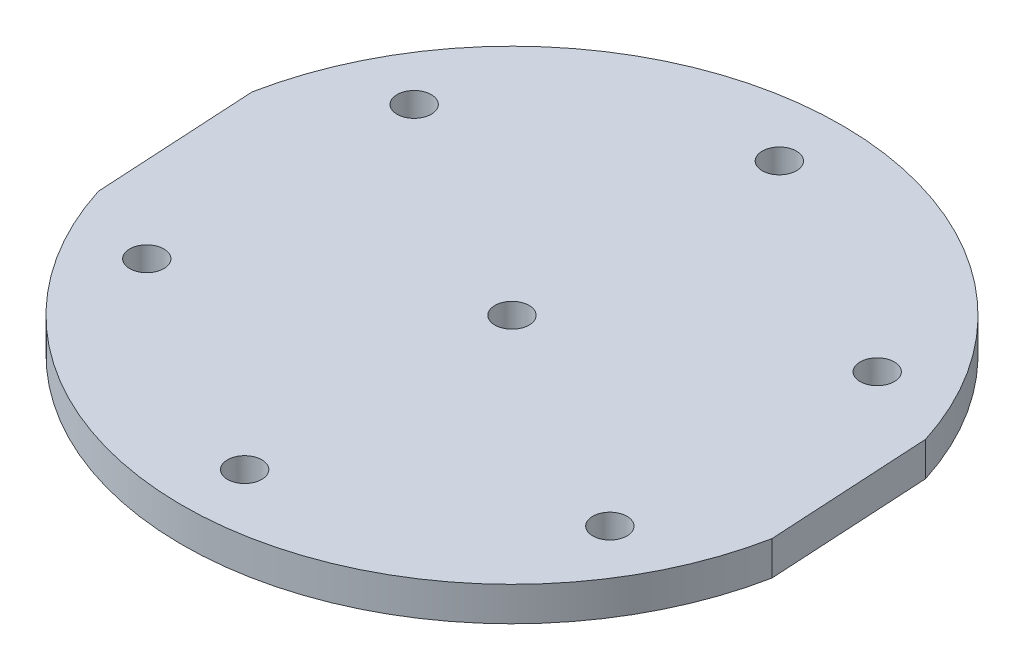
ISO-10303-21;
HEADER;
FILE_DESCRIPTION(('STEP AP214'),'2;1');
FILE_NAME('part.step','',(''),(''),'','','');
FILE_SCHEMA(('AUTOMOTIVE_DESIGN { 1 0 10303 214 1 1 1 1 }'));
ENDSEC;
DATA;
#1=APPLICATION_CONTEXT('core data for automotive mechanical design processes');
#2=APPLICATION_PROTOCOL_DEFINITION('international standard','automotive_design',2000,#1);
#3=PRODUCT_CONTEXT('',#1,'mechanical');
#4=PRODUCT('Part','Part','',(#3));
#5=PRODUCT_RELATED_PRODUCT_CATEGORY('part','',(#4));
#6=PRODUCT_DEFINITION_FORMATION('','',#4);
#7=PRODUCT_DEFINITION_CONTEXT('part definition',#1,'design');
#8=PRODUCT_DEFINITION('design','',#6,#7);
#9=PRODUCT_DEFINITION_SHAPE('','',#8);
#10=(LENGTH_UNIT() NAMED_UNIT(*) SI_UNIT(.MILLI.,.METRE.));
#11=(NAMED_UNIT(*) PLANE_ANGLE_UNIT() SI_UNIT($,.RADIAN.));
#12=(NAMED_UNIT(*) SI_UNIT($,.STERADIAN.) SOLID_ANGLE_UNIT());
#13=UNCERTAINTY_MEASURE_WITH_UNIT(LENGTH_MEASURE(1.E-05),#10,'distance_accuracy_value','');
#14=(GEOMETRIC_REPRESENTATION_CONTEXT(3) GLOBAL_UNCERTAINTY_ASSIGNED_CONTEXT((#13)) GLOBAL_UNIT_ASSIGNED_CONTEXT((#10,
#11,#12)) REPRESENTATION_CONTEXT('',''));
#15=CARTESIAN_POINT('',(0.,0.,0.));
#16=DIRECTION('',(0.,0.,1.));
#17=DIRECTION('',(1.,0.,0.));
#18=AXIS2_PLACEMENT_3D('',#15,#16,#17);
#19=CARTESIAN_POINT('',(0.,5.,0.));
#20=DIRECTION('',(0.,1.,0.));
#21=DIRECTION('',(0.,0.,1.));
#22=AXIS2_PLACEMENT_3D('',#19,#20,#21);
#23=PLANE('',#22);
#24=CARTESIAN_POINT('',(33.8615932879713,5.,-19.5500000000004));
#25=DIRECTION('',(0.,1.,0.));
#26=DIRECTION('',(-0.866025403784433,0.,0.50000000000001));
#27=AXIS2_PLACEMENT_3D('',#24,#25,#26);
#28=CIRCLE('',#27,2.5);
#29=CARTESIAN_POINT('',(31.6965297785102,5.,-18.3000000000004));
#30=VERTEX_POINT('',#29);
#31=EDGE_CURVE('E325',#30,#30,#28,.T.);
#32=ORIENTED_EDGE('',*,*,#31,.F.);
#33=EDGE_LOOP('',(#32));
#34=FACE_BOUND('',#33,.T.);
#35=CARTESIAN_POINT('',(33.8615932879717,5.,19.5499999999997));
#36=DIRECTION('',(0.,1.,0.));
#37=DIRECTION('',(-0.866025403784443,0.,-0.499999999999992));
#38=AXIS2_PLACEMENT_3D('',#35,#36,#37);
#39=CIRCLE('',#38,2.5);
#40=CARTESIAN_POINT('',(31.6965297785106,5.,18.2999999999997));
#41=VERTEX_POINT('',#40);
#42=EDGE_CURVE('E327',#41,#41,#39,.T.);
#43=ORIENTED_EDGE('',*,*,#42,.F.);
#44=EDGE_LOOP('',(#43));
#45=FACE_BOUND('',#44,.T.);
#46=CARTESIAN_POINT('',(0.,5.,39.1));
#47=DIRECTION('',(0.,1.,0.));
#48=DIRECTION('',(0.,0.,-1.));
#49=AXIS2_PLACEMENT_3D('',#46,#47,#48);
#50=CIRCLE('',#49,2.5);
#51=CARTESIAN_POINT('',(0.,5.,36.6));
#52=VERTEX_POINT('',#51);
#53=EDGE_CURVE('E330',#52,#52,#50,.T.);
#54=ORIENTED_EDGE('',*,*,#53,.F.);
#55=EDGE_LOOP('',(#54));
#56=FACE_BOUND('',#55,.T.);
#57=CARTESIAN_POINT('',(-33.8615932879715,5.,19.5500000000002));
#58=DIRECTION('',(0.,1.,0.));
#59=DIRECTION('',(0.866025403784436,0.,-0.500000000000004));
#60=AXIS2_PLACEMENT_3D('',#57,#58,#59);
#61=CIRCLE('',#60,2.5);
#62=CARTESIAN_POINT('',(-31.6965297785104,5.,18.3000000000001));
#63=VERTEX_POINT('',#62);
#64=EDGE_CURVE('E336',#63,#63,#61,.T.);
#65=ORIENTED_EDGE('',*,*,#64,.F.);
#66=EDGE_LOOP('',(#65));
#67=FACE_BOUND('',#66,.T.);
#68=CARTESIAN_POINT('',(-33.8615932879716,5.,-19.5499999999999));
#69=DIRECTION('',(0.,1.,0.));
#70=DIRECTION('',(0.86602540378444,0.,0.499999999999998));
#71=AXIS2_PLACEMENT_3D('',#68,#69,#70);
#72=CIRCLE('',#71,2.5);
#73=CARTESIAN_POINT('',(-31.6965297785105,5.,-18.2999999999999));
#74=VERTEX_POINT('',#73);
#75=EDGE_CURVE('E141',#74,#74,#72,.T.);
#76=ORIENTED_EDGE('',*,*,#75,.F.);
#77=EDGE_LOOP('',(#76));
#78=FACE_BOUND('',#77,.T.);
#79=CARTESIAN_POINT('',(0.,5.,-39.1));
#80=DIRECTION('',(0.,1.,0.));
#81=DIRECTION('',(0.,0.,1.));
#82=AXIS2_PLACEMENT_3D('',#79,#80,#81);
#83=CIRCLE('',#82,2.5);
#84=CARTESIAN_POINT('',(0.,5.,-36.6));
#85=VERTEX_POINT('',#84);
#86=EDGE_CURVE('E135',#85,#85,#83,.T.);
#87=ORIENTED_EDGE('',*,*,#86,.F.);
#88=EDGE_LOOP('',(#87));
#89=FACE_BOUND('',#88,.T.);
#90=CARTESIAN_POINT('',(0.,5.,0.));
#91=DIRECTION('',(0.,1.,0.));
#92=DIRECTION('',(0.,0.,1.));
#93=AXIS2_PLACEMENT_3D('',#90,#91,#92);
#94=CIRCLE('',#93,48.2);
#95=CARTESIAN_POINT('',(45.9547992990247,5.,-14.5394780300519));
#96=VERTEX_POINT('',#95);
#97=CARTESIAN_POINT('',(-47.2972714529636,5.,-9.28483242200295));
#98=VERTEX_POINT('',#97);
#99=EDGE_CURVE('E98',#96,#98,#94,.T.);
#100=ORIENTED_EDGE('',*,*,#99,.T.);
#101=DIRECTION('',(0.0562595889512739,0.,0.99841617507482));
#102=VECTOR('',#101,1.);
#103=CARTESIAN_POINT('',(-47.2972714529636,5.,-9.28483242200295));
#104=LINE('',#103,#102);
#105=CARTESIAN_POINT('',(-45.9547992990246,5.,14.5394780300519));
#106=VERTEX_POINT('',#105);
#107=EDGE_CURVE('E93',#98,#106,#104,.T.);
#108=ORIENTED_EDGE('',*,*,#107,.T.);
#109=CARTESIAN_POINT('',(0.,5.,0.));
#110=DIRECTION('',(0.,1.,0.));
#111=DIRECTION('',(0.,0.,1.));
#112=AXIS2_PLACEMENT_3D('',#109,#110,#111);
#113=CIRCLE('',#112,48.2);
#114=CARTESIAN_POINT('',(47.2972714529636,5.,9.28483242200299));
#115=VERTEX_POINT('',#114);
#116=EDGE_CURVE('E96',#106,#115,#113,.T.);
#117=ORIENTED_EDGE('',*,*,#116,.T.);
#118=DIRECTION('',(-0.0562595889512727,0.,-0.99841617507482));
#119=VECTOR('',#118,1.);
#120=CARTESIAN_POINT('',(45.9547992990247,5.,-14.5394780300519));
#121=LINE('',#120,#119);
#122=EDGE_CURVE('E63',#115,#96,#121,.T.);
#123=ORIENTED_EDGE('',*,*,#122,.T.);
#124=EDGE_LOOP('',(#100,#108,#117,#123));
#125=FACE_BOUND('',#124,.T.);
#126=CARTESIAN_POINT('',(0.,5.,0.));
#127=DIRECTION('',(0.,1.,0.));
#128=DIRECTION('',(0.,0.,1.));
#129=AXIS2_PLACEMENT_3D('',#126,#127,#128);
#130=CIRCLE('',#129,2.5);
#131=CARTESIAN_POINT('',(0.,5.,2.5));
#132=VERTEX_POINT('',#131);
#133=EDGE_CURVE('E119',#132,#132,#130,.T.);
#134=ORIENTED_EDGE('',*,*,#133,.F.);
#135=EDGE_LOOP('',(#134));
#136=FACE_BOUND('',#135,.T.);
#137=ADVANCED_FACE('F43',(#34,#45,#56,#67,#78,#89,#125,#136),#23,.T.);
#138=CARTESIAN_POINT('',(0.,0.,0.));
#139=DIRECTION('',(0.,1.,0.));
#140=DIRECTION('',(0.,0.,1.));
#141=AXIS2_PLACEMENT_3D('',#138,#139,#140);
#142=PLANE('',#141);
#143=CARTESIAN_POINT('',(33.8615932879713,0.,-19.5500000000004));
#144=DIRECTION('',(0.,1.,0.));
#145=DIRECTION('',(0.,0.,1.));
#146=AXIS2_PLACEMENT_3D('',#143,#144,#145);
#147=CIRCLE('',#146,2.5);
#148=CARTESIAN_POINT('',(33.8615932879713,0.,-17.0500000000004));
#149=VERTEX_POINT('',#148);
#150=EDGE_CURVE('E47',#149,#149,#147,.T.);
#151=ORIENTED_EDGE('',*,*,#150,.T.);
#152=EDGE_LOOP('',(#151));
#153=FACE_BOUND('',#152,.T.);
#154=CARTESIAN_POINT('',(33.8615932879717,0.,19.5499999999997));
#155=DIRECTION('',(0.,1.,0.));
#156=DIRECTION('',(0.,0.,1.));
#157=AXIS2_PLACEMENT_3D('',#154,#155,#156);
#158=CIRCLE('',#157,2.5);
#159=CARTESIAN_POINT('',(33.8615932879717,0.,22.0499999999997));
#160=VERTEX_POINT('',#159);
#161=EDGE_CURVE('E148',#160,#160,#158,.T.);
#162=ORIENTED_EDGE('',*,*,#161,.T.);
#163=EDGE_LOOP('',(#162));
#164=FACE_BOUND('',#163,.T.);
#165=CARTESIAN_POINT('',(0.,0.,39.1));
#166=DIRECTION('',(0.,1.,0.));
#167=DIRECTION('',(0.,0.,1.));
#168=AXIS2_PLACEMENT_3D('',#165,#166,#167);
#169=CIRCLE('',#168,2.5);
#170=CARTESIAN_POINT('',(0.,0.,41.6));
#171=VERTEX_POINT('',#170);
#172=EDGE_CURVE('E145',#171,#171,#169,.T.);
#173=ORIENTED_EDGE('',*,*,#172,.T.);
#174=EDGE_LOOP('',(#173));
#175=FACE_BOUND('',#174,.T.);
#176=CARTESIAN_POINT('',(-33.8615932879715,0.,19.5500000000002));
#177=DIRECTION('',(0.,1.,0.));
#178=DIRECTION('',(0.,0.,1.));
#179=AXIS2_PLACEMENT_3D('',#176,#177,#178);
#180=CIRCLE('',#179,2.5);
#181=CARTESIAN_POINT('',(-33.8615932879715,0.,22.0500000000002));
#182=VERTEX_POINT('',#181);
#183=EDGE_CURVE('E140',#182,#182,#180,.T.);
#184=ORIENTED_EDGE('',*,*,#183,.T.);
#185=EDGE_LOOP('',(#184));
#186=FACE_BOUND('',#185,.T.);
#187=CARTESIAN_POINT('',(-33.8615932879716,0.,-19.5499999999999));
#188=DIRECTION('',(0.,1.,0.));
#189=DIRECTION('',(0.,0.,1.));
#190=AXIS2_PLACEMENT_3D('',#187,#188,#189);
#191=CIRCLE('',#190,2.5);
#192=CARTESIAN_POINT('',(-33.8615932879716,0.,-17.0499999999999));
#193=VERTEX_POINT('',#192);
#194=EDGE_CURVE('E136',#193,#193,#191,.T.);
#195=ORIENTED_EDGE('',*,*,#194,.T.);
#196=EDGE_LOOP('',(#195));
#197=FACE_BOUND('',#196,.T.);
#198=CARTESIAN_POINT('',(0.,0.,-39.1));
#199=DIRECTION('',(0.,1.,0.));
#200=DIRECTION('',(0.,0.,1.));
#201=AXIS2_PLACEMENT_3D('',#198,#199,#200);
#202=CIRCLE('',#201,2.5);
#203=CARTESIAN_POINT('',(0.,0.,-36.6));
#204=VERTEX_POINT('',#203);
#205=EDGE_CURVE('E130',#204,#204,#202,.T.);
#206=ORIENTED_EDGE('',*,*,#205,.T.);
#207=EDGE_LOOP('',(#206));
#208=FACE_BOUND('',#207,.T.);
#209=CARTESIAN_POINT('',(0.,0.,0.));
#210=DIRECTION('',(0.,1.,0.));
#211=DIRECTION('',(0.,0.,1.));
#212=AXIS2_PLACEMENT_3D('',#209,#210,#211);
#213=CIRCLE('',#212,48.2);
#214=CARTESIAN_POINT('',(45.9547992990247,0.,-14.5394780300519));
#215=VERTEX_POINT('',#214);
#216=CARTESIAN_POINT('',(-47.2972714529636,0.,-9.28483242200295));
#217=VERTEX_POINT('',#216);
#218=EDGE_CURVE('E115',#215,#217,#213,.T.);
#219=ORIENTED_EDGE('',*,*,#218,.F.);
#220=DIRECTION('',(-0.0562595889512727,0.,-0.99841617507482));
#221=VECTOR('',#220,1.);
#222=CARTESIAN_POINT('',(45.9547992990247,0.,-14.5394780300519));
#223=LINE('',#222,#221);
#224=CARTESIAN_POINT('',(47.2972714529636,0.,9.28483242200299));
#225=VERTEX_POINT('',#224);
#226=EDGE_CURVE('E86',#225,#215,#223,.T.);
#227=ORIENTED_EDGE('',*,*,#226,.F.);
#228=CARTESIAN_POINT('',(0.,0.,0.));
#229=DIRECTION('',(0.,1.,0.));
#230=DIRECTION('',(0.,0.,1.));
#231=AXIS2_PLACEMENT_3D('',#228,#229,#230);
#232=CIRCLE('',#231,48.2);
#233=CARTESIAN_POINT('',(-45.9547992990246,0.,14.5394780300519));
#234=VERTEX_POINT('',#233);
#235=EDGE_CURVE('E80',#234,#225,#232,.T.);
#236=ORIENTED_EDGE('',*,*,#235,.F.);
#237=DIRECTION('',(0.0562595889512739,0.,0.99841617507482));
#238=VECTOR('',#237,1.);
#239=CARTESIAN_POINT('',(-47.2972714529636,0.,-9.28483242200295));
#240=LINE('',#239,#238);
#241=EDGE_CURVE('E103',#217,#234,#240,.T.);
#242=ORIENTED_EDGE('',*,*,#241,.F.);
#243=EDGE_LOOP('',(#219,#227,#236,#242));
#244=FACE_BOUND('',#243,.T.);
#245=CARTESIAN_POINT('',(0.,0.,0.));
#246=DIRECTION('',(0.,1.,0.));
#247=DIRECTION('',(0.,0.,1.));
#248=AXIS2_PLACEMENT_3D('',#245,#246,#247);
#249=CIRCLE('',#248,2.5);
#250=CARTESIAN_POINT('',(0.,0.,2.5));
#251=VERTEX_POINT('',#250);
#252=EDGE_CURVE('E134',#251,#251,#249,.T.);
#253=ORIENTED_EDGE('',*,*,#252,.T.);
#254=EDGE_LOOP('',(#253));
#255=FACE_BOUND('',#254,.T.);
#256=ADVANCED_FACE('F173',(#153,#164,#175,#186,#197,#208,#244,#255),#142,.F.);
#257=CARTESIAN_POINT('',(0.,5.,0.));
#258=DIRECTION('',(0.,-1.,0.));
#259=DIRECTION('',(0.,0.,-1.));
#260=AXIS2_PLACEMENT_3D('',#257,#258,#259);
#261=CYLINDRICAL_SURFACE('',#260,48.2);
#262=ORIENTED_EDGE('',*,*,#218,.T.);
#263=DIRECTION('',(0.,-1.,0.));
#264=VECTOR('',#263,1.);
#265=CARTESIAN_POINT('',(-47.2972714529636,5.,-9.28483242200295));
#266=LINE('',#265,#264);
#267=EDGE_CURVE('E11',#98,#217,#266,.T.);
#268=ORIENTED_EDGE('',*,*,#267,.F.);
#269=ORIENTED_EDGE('',*,*,#99,.F.);
#270=DIRECTION('',(0.,-1.,0.));
#271=VECTOR('',#270,1.);
#272=CARTESIAN_POINT('',(45.9547992990247,5.,-14.5394780300519));
#273=LINE('',#272,#271);
#274=EDGE_CURVE('E111',#96,#215,#273,.T.);
#275=ORIENTED_EDGE('',*,*,#274,.T.);
#276=EDGE_LOOP('',(#262,#268,#269,#275));
#277=FACE_BOUND('',#276,.T.);
#278=ADVANCED_FACE('F45',(#277),#261,.T.);
#279=CARTESIAN_POINT('',(-47.2972714529636,5.,-9.28483242200295));
#280=DIRECTION('',(0.99841617507482,0.,-0.0562595889512739));
#281=DIRECTION('',(-0.0562595889512739,0.,-0.99841617507482));
#282=AXIS2_PLACEMENT_3D('',#279,#280,#281);
#283=PLANE('',#282);
#284=ORIENTED_EDGE('',*,*,#241,.T.);
#285=DIRECTION('',(0.,-1.,0.));
#286=VECTOR('',#285,1.);
#287=CARTESIAN_POINT('',(-45.9547992990246,5.,14.5394780300519));
#288=LINE('',#287,#286);
#289=EDGE_CURVE('E54',#106,#234,#288,.T.);
#290=ORIENTED_EDGE('',*,*,#289,.F.);
#291=ORIENTED_EDGE('',*,*,#107,.F.);
#292=ORIENTED_EDGE('',*,*,#267,.T.);
#293=EDGE_LOOP('',(#284,#290,#291,#292));
#294=FACE_BOUND('',#293,.T.);
#295=ADVANCED_FACE('F102',(#294),#283,.F.);
#296=CARTESIAN_POINT('',(0.,5.,0.));
#297=DIRECTION('',(0.,-1.,0.));
#298=DIRECTION('',(0.,0.,-1.));
#299=AXIS2_PLACEMENT_3D('',#296,#297,#298);
#300=CYLINDRICAL_SURFACE('',#299,48.2);
#301=ORIENTED_EDGE('',*,*,#235,.T.);
#302=DIRECTION('',(0.,-1.,0.));
#303=VECTOR('',#302,1.);
#304=CARTESIAN_POINT('',(47.2972714529636,5.,9.28483242200299));
#305=LINE('',#304,#303);
#306=EDGE_CURVE('E105',#115,#225,#305,.T.);
#307=ORIENTED_EDGE('',*,*,#306,.F.);
#308=ORIENTED_EDGE('',*,*,#116,.F.);
#309=ORIENTED_EDGE('',*,*,#289,.T.);
#310=EDGE_LOOP('',(#301,#307,#308,#309));
#311=FACE_BOUND('',#310,.T.);
#312=ADVANCED_FACE('F107',(#311),#300,.T.);
#313=CARTESIAN_POINT('',(45.9547992990247,5.,-14.5394780300519));
#314=DIRECTION('',(-0.99841617507482,0.,0.0562595889512727));
#315=DIRECTION('',(0.0562595889512727,0.,0.99841617507482));
#316=AXIS2_PLACEMENT_3D('',#313,#314,#315);
#317=PLANE('',#316);
#318=ORIENTED_EDGE('',*,*,#226,.T.);
#319=ORIENTED_EDGE('',*,*,#274,.F.);
#320=ORIENTED_EDGE('',*,*,#122,.F.);
#321=ORIENTED_EDGE('',*,*,#306,.T.);
#322=EDGE_LOOP('',(#318,#319,#320,#321));
#323=FACE_BOUND('',#322,.T.);
#324=ADVANCED_FACE('F178',(#323),#317,.F.);
#325=CARTESIAN_POINT('',(0.,5.,0.));
#326=DIRECTION('',(0.,-1.,0.));
#327=DIRECTION('',(0.,0.,-1.));
#328=AXIS2_PLACEMENT_3D('',#325,#326,#327);
#329=CYLINDRICAL_SURFACE('',#328,2.5);
#330=ORIENTED_EDGE('',*,*,#133,.T.);
#331=EDGE_LOOP('',(#330));
#332=FACE_BOUND('',#331,.T.);
#333=ORIENTED_EDGE('',*,*,#252,.F.);
#334=EDGE_LOOP('',(#333));
#335=FACE_BOUND('',#334,.T.);
#336=ADVANCED_FACE('F175',(#332,#335),#329,.F.);
#337=CARTESIAN_POINT('',(0.,-15.,-39.1));
#338=DIRECTION('',(0.,1.,0.));
#339=DIRECTION('',(0.,0.,1.));
#340=AXIS2_PLACEMENT_3D('',#337,#338,#339);
#341=CYLINDRICAL_SURFACE('',#340,2.5);
#342=ORIENTED_EDGE('',*,*,#86,.T.);
#343=EDGE_LOOP('',(#342));
#344=FACE_BOUND('',#343,.T.);
#345=ORIENTED_EDGE('',*,*,#205,.F.);
#346=EDGE_LOOP('',(#345));
#347=FACE_BOUND('',#346,.T.);
#348=ADVANCED_FACE('F177',(#344,#347),#341,.F.);
#349=CARTESIAN_POINT('',(-33.8615932879716,-15.,-19.5499999999999));
#350=DIRECTION('',(0.,1.,0.));
#351=DIRECTION('',(0.,0.,1.));
#352=AXIS2_PLACEMENT_3D('',#349,#350,#351);
#353=CYLINDRICAL_SURFACE('',#352,2.5);
#354=ORIENTED_EDGE('',*,*,#75,.T.);
#355=EDGE_LOOP('',(#354));
#356=FACE_BOUND('',#355,.T.);
#357=ORIENTED_EDGE('',*,*,#194,.F.);
#358=EDGE_LOOP('',(#357));
#359=FACE_BOUND('',#358,.T.);
#360=ADVANCED_FACE('F185',(#356,#359),#353,.F.);
#361=CARTESIAN_POINT('',(-33.8615932879715,-15.,19.5500000000002));
#362=DIRECTION('',(0.,1.,0.));
#363=DIRECTION('',(0.,0.,1.));
#364=AXIS2_PLACEMENT_3D('',#361,#362,#363);
#365=CYLINDRICAL_SURFACE('',#364,2.5);
#366=ORIENTED_EDGE('',*,*,#64,.T.);
#367=EDGE_LOOP('',(#366));
#368=FACE_BOUND('',#367,.T.);
#369=ORIENTED_EDGE('',*,*,#183,.F.);
#370=EDGE_LOOP('',(#369));
#371=FACE_BOUND('',#370,.T.);
#372=ADVANCED_FACE('F225',(#368,#371),#365,.F.);
#373=CARTESIAN_POINT('',(0.,-15.,39.1));
#374=DIRECTION('',(0.,1.,0.));
#375=DIRECTION('',(0.,0.,1.));
#376=AXIS2_PLACEMENT_3D('',#373,#374,#375);
#377=CYLINDRICAL_SURFACE('',#376,2.5);
#378=ORIENTED_EDGE('',*,*,#53,.T.);
#379=EDGE_LOOP('',(#378));
#380=FACE_BOUND('',#379,.T.);
#381=ORIENTED_EDGE('',*,*,#172,.F.);
#382=EDGE_LOOP('',(#381));
#383=FACE_BOUND('',#382,.T.);
#384=ADVANCED_FACE('F237',(#380,#383),#377,.F.);
#385=CARTESIAN_POINT('',(33.8615932879717,-15.,19.5499999999997));
#386=DIRECTION('',(0.,1.,0.));
#387=DIRECTION('',(0.,0.,1.));
#388=AXIS2_PLACEMENT_3D('',#385,#386,#387);
#389=CYLINDRICAL_SURFACE('',#388,2.5);
#390=ORIENTED_EDGE('',*,*,#42,.T.);
#391=EDGE_LOOP('',(#390));
#392=FACE_BOUND('',#391,.T.);
#393=ORIENTED_EDGE('',*,*,#161,.F.);
#394=EDGE_LOOP('',(#393));
#395=FACE_BOUND('',#394,.T.);
#396=ADVANCED_FACE('F248',(#392,#395),#389,.F.);
#397=CARTESIAN_POINT('',(33.8615932879713,-15.,-19.5500000000004));
#398=DIRECTION('',(0.,1.,0.));
#399=DIRECTION('',(0.,0.,1.));
#400=AXIS2_PLACEMENT_3D('',#397,#398,#399);
#401=CYLINDRICAL_SURFACE('',#400,2.5);
#402=ORIENTED_EDGE('',*,*,#31,.T.);
#403=EDGE_LOOP('',(#402));
#404=FACE_BOUND('',#403,.T.);
#405=ORIENTED_EDGE('',*,*,#150,.F.);
#406=EDGE_LOOP('',(#405));
#407=FACE_BOUND('',#406,.T.);
#408=ADVANCED_FACE('F259',(#404,#407),#401,.F.);
#409=CLOSED_SHELL('',(#137,#256,#278,#295,#312,#324,#336,#348,#360,#372,#384,#396,#408));
#410=MANIFOLD_SOLID_BREP('B2',#409);
#411=ADVANCED_BREP_SHAPE_REPRESENTATION('',(#18,#410),#14);
#412=SHAPE_DEFINITION_REPRESENTATION(#9,#411);
ENDSEC;
END-ISO-10303-21;
